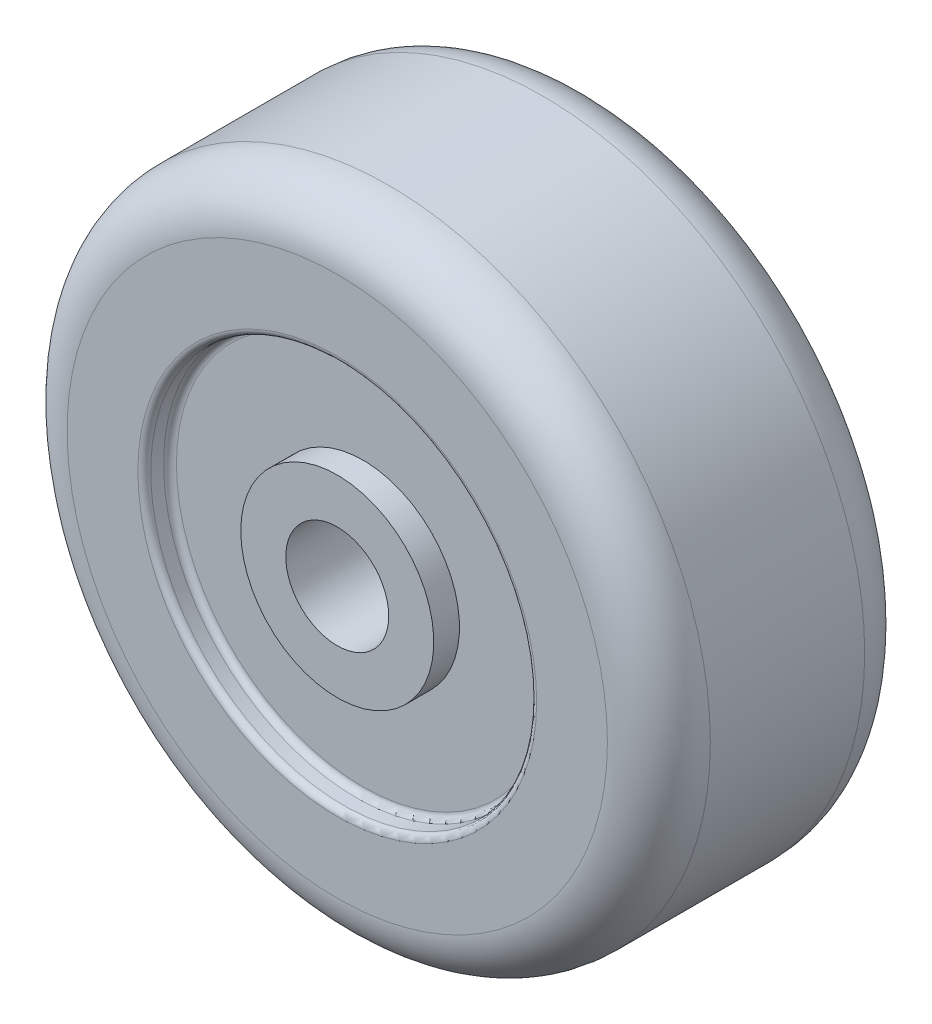
ISO-10303-21;
HEADER;
FILE_DESCRIPTION(('STEP AP214'),'2;1');
FILE_NAME('part.step','',(''),(''),'','','');
FILE_SCHEMA(('AUTOMOTIVE_DESIGN { 1 0 10303 214 1 1 1 1 }'));
ENDSEC;
DATA;
#1=APPLICATION_CONTEXT('core data for automotive mechanical design processes');
#2=APPLICATION_PROTOCOL_DEFINITION('international standard','automotive_design',2000,#1);
#3=PRODUCT_CONTEXT('',#1,'mechanical');
#4=PRODUCT('Part','Part','',(#3));
#5=PRODUCT_RELATED_PRODUCT_CATEGORY('part','',(#4));
#6=PRODUCT_DEFINITION_FORMATION('','',#4);
#7=PRODUCT_DEFINITION_CONTEXT('part definition',#1,'design');
#8=PRODUCT_DEFINITION('design','',#6,#7);
#9=PRODUCT_DEFINITION_SHAPE('','',#8);
#10=(LENGTH_UNIT() NAMED_UNIT(*) SI_UNIT(.MILLI.,.METRE.));
#11=(NAMED_UNIT(*) PLANE_ANGLE_UNIT() SI_UNIT($,.RADIAN.));
#12=(NAMED_UNIT(*) SI_UNIT($,.STERADIAN.) SOLID_ANGLE_UNIT());
#13=UNCERTAINTY_MEASURE_WITH_UNIT(LENGTH_MEASURE(1.E-05),#10,'distance_accuracy_value','');
#14=(GEOMETRIC_REPRESENTATION_CONTEXT(3) GLOBAL_UNCERTAINTY_ASSIGNED_CONTEXT((#13)) GLOBAL_UNIT_ASSIGNED_CONTEXT((#10,
#11,#12)) REPRESENTATION_CONTEXT('',''));
#15=CARTESIAN_POINT('',(0.,0.,0.));
#16=DIRECTION('',(0.,0.,1.));
#17=DIRECTION('',(1.,0.,0.));
#18=AXIS2_PLACEMENT_3D('',#15,#16,#17);
#19=CARTESIAN_POINT('',(0.,0.,10.));
#20=DIRECTION('',(0.,0.,1.));
#21=DIRECTION('',(1.,0.,0.));
#22=AXIS2_PLACEMENT_3D('',#19,#20,#21);
#23=PLANE('',#22);
#24=CARTESIAN_POINT('',(0.,0.,10.));
#25=DIRECTION('',(0.,0.,1.));
#26=DIRECTION('',(1.,0.,0.));
#27=AXIS2_PLACEMENT_3D('',#24,#25,#26);
#28=CIRCLE('',#27,4.);
#29=CARTESIAN_POINT('',(4.,0.,10.));
#30=VERTEX_POINT('',#29);
#31=EDGE_CURVE('E58',#30,#30,#28,.T.);
#32=ORIENTED_EDGE('',*,*,#31,.F.);
#33=EDGE_LOOP('',(#32));
#34=FACE_BOUND('',#33,.T.);
#35=CARTESIAN_POINT('',(0.,0.,10.));
#36=DIRECTION('',(0.,0.,-1.));
#37=DIRECTION('',(-1.,0.,0.));
#38=AXIS2_PLACEMENT_3D('',#35,#36,#37);
#39=CIRCLE('',#38,7.5);
#40=CARTESIAN_POINT('',(-7.5,0.,10.));
#41=VERTEX_POINT('',#40);
#42=EDGE_CURVE('E71',#41,#41,#39,.T.);
#43=ORIENTED_EDGE('',*,*,#42,.F.);
#44=EDGE_LOOP('',(#43));
#45=FACE_BOUND('',#44,.T.);
#46=ADVANCED_FACE('F14',(#34,#45),#23,.T.);
#47=CARTESIAN_POINT('',(0.,0.,-10.));
#48=DIRECTION('',(0.,0.,1.));
#49=DIRECTION('',(1.,0.,0.));
#50=AXIS2_PLACEMENT_3D('',#47,#48,#49);
#51=PLANE('',#50);
#52=CARTESIAN_POINT('',(0.,0.,-10.));
#53=DIRECTION('',(0.,0.,1.));
#54=DIRECTION('',(1.,0.,0.));
#55=AXIS2_PLACEMENT_3D('',#52,#53,#54);
#56=CIRCLE('',#55,4.);
#57=CARTESIAN_POINT('',(4.,0.,-10.));
#58=VERTEX_POINT('',#57);
#59=EDGE_CURVE('E59',#58,#58,#56,.T.);
#60=ORIENTED_EDGE('',*,*,#59,.T.);
#61=EDGE_LOOP('',(#60));
#62=FACE_BOUND('',#61,.T.);
#63=CARTESIAN_POINT('',(0.,0.,-10.));
#64=DIRECTION('',(0.,0.,-1.));
#65=DIRECTION('',(-1.,0.,0.));
#66=AXIS2_PLACEMENT_3D('',#63,#64,#65);
#67=CIRCLE('',#66,7.5);
#68=CARTESIAN_POINT('',(-7.5,0.,-10.));
#69=VERTEX_POINT('',#68);
#70=EDGE_CURVE('E65',#69,#69,#67,.T.);
#71=ORIENTED_EDGE('',*,*,#70,.T.);
#72=EDGE_LOOP('',(#71));
#73=FACE_BOUND('',#72,.T.);
#74=ADVANCED_FACE('F88',(#62,#73),#51,.F.);
#75=CARTESIAN_POINT('',(0.,0.,10.));
#76=DIRECTION('',(0.,0.,1.));
#77=DIRECTION('',(1.,0.,0.));
#78=AXIS2_PLACEMENT_3D('',#75,#76,#77);
#79=CIRCLE('',#78,15.5);
#80=CARTESIAN_POINT('',(15.5,0.,10.));
#81=VERTEX_POINT('',#80);
#82=EDGE_CURVE('E29',#81,#81,#79,.F.);
#83=ORIENTED_EDGE('',*,*,#82,.T.);
#84=EDGE_LOOP('',(#83));
#85=FACE_BOUND('',#84,.T.);
#86=CARTESIAN_POINT('',(0.,0.,10.));
#87=DIRECTION('',(0.,0.,1.));
#88=DIRECTION('',(1.,0.,0.));
#89=AXIS2_PLACEMENT_3D('',#86,#87,#88);
#90=CIRCLE('',#89,21.);
#91=CARTESIAN_POINT('',(21.,0.,10.));
#92=VERTEX_POINT('',#91);
#93=EDGE_CURVE('E55',#92,#92,#90,.T.);
#94=ORIENTED_EDGE('',*,*,#93,.T.);
#95=EDGE_LOOP('',(#94));
#96=FACE_BOUND('',#95,.T.);
#97=ADVANCED_FACE('F91',(#85,#96),#23,.T.);
#98=CARTESIAN_POINT('',(0.,0.,-10.));
#99=DIRECTION('',(0.,0.,1.));
#100=DIRECTION('',(1.,0.,0.));
#101=AXIS2_PLACEMENT_3D('',#98,#99,#100);
#102=CIRCLE('',#101,15.5);
#103=CARTESIAN_POINT('',(15.5,0.,-10.));
#104=VERTEX_POINT('',#103);
#105=EDGE_CURVE('E37',#104,#104,#102,.T.);
#106=ORIENTED_EDGE('',*,*,#105,.T.);
#107=EDGE_LOOP('',(#106));
#108=FACE_BOUND('',#107,.T.);
#109=CARTESIAN_POINT('',(0.,0.,-10.));
#110=DIRECTION('',(0.,0.,1.));
#111=DIRECTION('',(1.,0.,0.));
#112=AXIS2_PLACEMENT_3D('',#109,#110,#111);
#113=CIRCLE('',#112,21.);
#114=CARTESIAN_POINT('',(21.,0.,-10.));
#115=VERTEX_POINT('',#114);
#116=EDGE_CURVE('E46',#115,#115,#113,.F.);
#117=ORIENTED_EDGE('',*,*,#116,.T.);
#118=EDGE_LOOP('',(#117));
#119=FACE_BOUND('',#118,.T.);
#120=ADVANCED_FACE('F99',(#108,#119),#51,.F.);
#121=CARTESIAN_POINT('',(0.,0.,10.));
#122=DIRECTION('',(0.,0.,-1.));
#123=DIRECTION('',(-1.,0.,0.));
#124=AXIS2_PLACEMENT_3D('',#121,#122,#123);
#125=CYLINDRICAL_SURFACE('',#124,25.);
#126=CARTESIAN_POINT('',(0.,0.,6.));
#127=DIRECTION('',(0.,0.,1.));
#128=DIRECTION('',(1.,0.,0.));
#129=AXIS2_PLACEMENT_3D('',#126,#127,#128);
#130=CIRCLE('',#129,25.);
#131=CARTESIAN_POINT('',(25.,0.,6.));
#132=VERTEX_POINT('',#131);
#133=EDGE_CURVE('E49',#132,#132,#130,.F.);
#134=ORIENTED_EDGE('',*,*,#133,.T.);
#135=EDGE_LOOP('',(#134));
#136=FACE_BOUND('',#135,.T.);
#137=CARTESIAN_POINT('',(0.,0.,-6.));
#138=DIRECTION('',(0.,0.,1.));
#139=DIRECTION('',(1.,0.,0.));
#140=AXIS2_PLACEMENT_3D('',#137,#138,#139);
#141=CIRCLE('',#140,25.);
#142=CARTESIAN_POINT('',(25.,0.,-6.));
#143=VERTEX_POINT('',#142);
#144=EDGE_CURVE('E52',#143,#143,#141,.T.);
#145=ORIENTED_EDGE('',*,*,#144,.T.);
#146=EDGE_LOOP('',(#145));
#147=FACE_BOUND('',#146,.T.);
#148=ADVANCED_FACE('F108',(#136,#147),#125,.T.);
#149=CARTESIAN_POINT('',(0.,0.,10.));
#150=DIRECTION('',(0.,0.,-1.));
#151=DIRECTION('',(-1.,0.,0.));
#152=AXIS2_PLACEMENT_3D('',#149,#150,#151);
#153=CYLINDRICAL_SURFACE('',#152,4.);
#154=ORIENTED_EDGE('',*,*,#31,.T.);
#155=EDGE_LOOP('',(#154));
#156=FACE_BOUND('',#155,.T.);
#157=ORIENTED_EDGE('',*,*,#59,.F.);
#158=EDGE_LOOP('',(#157));
#159=FACE_BOUND('',#158,.T.);
#160=ADVANCED_FACE('F117',(#156,#159),#153,.F.);
#161=CARTESIAN_POINT('',(0.,0.,6.));
#162=DIRECTION('',(0.,0.,1.));
#163=DIRECTION('',(1.,0.,0.));
#164=AXIS2_PLACEMENT_3D('',#161,#162,#163);
#165=TOROIDAL_SURFACE('',#164,21.,4.);
#166=ORIENTED_EDGE('',*,*,#133,.F.);
#167=EDGE_LOOP('',(#166));
#168=FACE_BOUND('',#167,.T.);
#169=ORIENTED_EDGE('',*,*,#93,.F.);
#170=EDGE_LOOP('',(#169));
#171=FACE_BOUND('',#170,.T.);
#172=ADVANCED_FACE('F114',(#168,#171),#165,.T.);
#173=CARTESIAN_POINT('',(0.,0.,-6.));
#174=DIRECTION('',(0.,0.,1.));
#175=DIRECTION('',(1.,0.,0.));
#176=AXIS2_PLACEMENT_3D('',#173,#174,#175);
#177=TOROIDAL_SURFACE('',#176,21.,4.);
#178=ORIENTED_EDGE('',*,*,#116,.F.);
#179=EDGE_LOOP('',(#178));
#180=FACE_BOUND('',#179,.T.);
#181=ORIENTED_EDGE('',*,*,#144,.F.);
#182=EDGE_LOOP('',(#181));
#183=FACE_BOUND('',#182,.T.);
#184=ADVANCED_FACE('F116',(#180,#183),#177,.T.);
#185=CARTESIAN_POINT('',(0.,0.,-8.));
#186=DIRECTION('',(0.,0.,-1.));
#187=DIRECTION('',(-1.,0.,0.));
#188=AXIS2_PLACEMENT_3D('',#185,#186,#187);
#189=CYLINDRICAL_SURFACE('',#188,15.);
#190=CARTESIAN_POINT('',(0.,0.,-9.5));
#191=DIRECTION('',(0.,0.,1.));
#192=DIRECTION('',(1.,0.,0.));
#193=AXIS2_PLACEMENT_3D('',#190,#191,#192);
#194=CIRCLE('',#193,15.);
#195=CARTESIAN_POINT('',(15.,0.,-9.5));
#196=VERTEX_POINT('',#195);
#197=EDGE_CURVE('E40',#196,#196,#194,.F.);
#198=ORIENTED_EDGE('',*,*,#197,.T.);
#199=EDGE_LOOP('',(#198));
#200=FACE_BOUND('',#199,.T.);
#201=CARTESIAN_POINT('',(0.,0.,-8.5));
#202=DIRECTION('',(0.,0.,-1.));
#203=DIRECTION('',(-1.,0.,0.));
#204=AXIS2_PLACEMENT_3D('',#201,#202,#203);
#205=CIRCLE('',#204,15.);
#206=CARTESIAN_POINT('',(-15.,0.,-8.5));
#207=VERTEX_POINT('',#206);
#208=EDGE_CURVE('E43',#207,#207,#205,.F.);
#209=ORIENTED_EDGE('',*,*,#208,.T.);
#210=EDGE_LOOP('',(#209));
#211=FACE_BOUND('',#210,.T.);
#212=ADVANCED_FACE('F125',(#200,#211),#189,.F.);
#213=CARTESIAN_POINT('',(0.,0.,-8.));
#214=DIRECTION('',(0.,0.,-1.));
#215=DIRECTION('',(-1.,0.,0.));
#216=AXIS2_PLACEMENT_3D('',#213,#214,#215);
#217=PLANE('',#216);
#218=CARTESIAN_POINT('',(0.,0.,-8.));
#219=DIRECTION('',(0.,0.,-1.));
#220=DIRECTION('',(-1.,0.,0.));
#221=AXIS2_PLACEMENT_3D('',#218,#219,#220);
#222=CIRCLE('',#221,14.5);
#223=CARTESIAN_POINT('',(-14.5,0.,-8.));
#224=VERTEX_POINT('',#223);
#225=EDGE_CURVE('E34',#224,#224,#222,.T.);
#226=ORIENTED_EDGE('',*,*,#225,.T.);
#227=EDGE_LOOP('',(#226));
#228=FACE_BOUND('',#227,.T.);
#229=CARTESIAN_POINT('',(0.,0.,-8.));
#230=DIRECTION('',(0.,0.,-1.));
#231=DIRECTION('',(-1.,0.,0.));
#232=AXIS2_PLACEMENT_3D('',#229,#230,#231);
#233=CIRCLE('',#232,7.5);
#234=CARTESIAN_POINT('',(-7.5,0.,-8.));
#235=VERTEX_POINT('',#234);
#236=EDGE_CURVE('E62',#235,#235,#233,.T.);
#237=ORIENTED_EDGE('',*,*,#236,.F.);
#238=EDGE_LOOP('',(#237));
#239=FACE_BOUND('',#238,.T.);
#240=ADVANCED_FACE('F164',(#228,#239),#217,.T.);
#241=CARTESIAN_POINT('',(0.,0.,-8.));
#242=DIRECTION('',(0.,0.,-1.));
#243=DIRECTION('',(-1.,0.,0.));
#244=AXIS2_PLACEMENT_3D('',#241,#242,#243);
#245=CYLINDRICAL_SURFACE('',#244,7.5);
#246=ORIENTED_EDGE('',*,*,#236,.T.);
#247=EDGE_LOOP('',(#246));
#248=FACE_BOUND('',#247,.T.);
#249=ORIENTED_EDGE('',*,*,#70,.F.);
#250=EDGE_LOOP('',(#249));
#251=FACE_BOUND('',#250,.T.);
#252=ADVANCED_FACE('F159',(#248,#251),#245,.T.);
#253=CARTESIAN_POINT('',(0.,0.,8.));
#254=DIRECTION('',(0.,0.,1.));
#255=DIRECTION('',(-1.,0.,0.));
#256=AXIS2_PLACEMENT_3D('',#253,#254,#255);
#257=PLANE('',#256);
#258=CARTESIAN_POINT('',(0.,0.,8.));
#259=DIRECTION('',(0.,0.,1.));
#260=DIRECTION('',(1.,0.,0.));
#261=AXIS2_PLACEMENT_3D('',#258,#259,#260);
#262=CIRCLE('',#261,14.5);
#263=CARTESIAN_POINT('',(14.5,0.,8.));
#264=VERTEX_POINT('',#263);
#265=EDGE_CURVE('E10',#264,#264,#262,.T.);
#266=ORIENTED_EDGE('',*,*,#265,.T.);
#267=EDGE_LOOP('',(#266));
#268=FACE_BOUND('',#267,.T.);
#269=CARTESIAN_POINT('',(0.,0.,8.));
#270=DIRECTION('',(0.,0.,-1.));
#271=DIRECTION('',(-1.,0.,0.));
#272=AXIS2_PLACEMENT_3D('',#269,#270,#271);
#273=CIRCLE('',#272,7.5);
#274=CARTESIAN_POINT('',(-7.5,0.,8.));
#275=VERTEX_POINT('',#274);
#276=EDGE_CURVE('E68',#275,#275,#273,.T.);
#277=ORIENTED_EDGE('',*,*,#276,.T.);
#278=EDGE_LOOP('',(#277));
#279=FACE_BOUND('',#278,.T.);
#280=ADVANCED_FACE('F77',(#268,#279),#257,.T.);
#281=CARTESIAN_POINT('',(0.,0.,8.));
#282=DIRECTION('',(0.,0.,1.));
#283=DIRECTION('',(1.,0.,0.));
#284=AXIS2_PLACEMENT_3D('',#281,#282,#283);
#285=CYLINDRICAL_SURFACE('',#284,15.);
#286=CARTESIAN_POINT('',(0.,0.,9.5));
#287=DIRECTION('',(0.,0.,1.));
#288=DIRECTION('',(1.,0.,0.));
#289=AXIS2_PLACEMENT_3D('',#286,#287,#288);
#290=CIRCLE('',#289,15.);
#291=CARTESIAN_POINT('',(15.,0.,9.5));
#292=VERTEX_POINT('',#291);
#293=EDGE_CURVE('E21',#292,#292,#290,.T.);
#294=ORIENTED_EDGE('',*,*,#293,.T.);
#295=EDGE_LOOP('',(#294));
#296=FACE_BOUND('',#295,.T.);
#297=CARTESIAN_POINT('',(0.,0.,8.5));
#298=DIRECTION('',(0.,0.,1.));
#299=DIRECTION('',(1.,0.,0.));
#300=AXIS2_PLACEMENT_3D('',#297,#298,#299);
#301=CIRCLE('',#300,15.);
#302=CARTESIAN_POINT('',(15.,0.,8.5));
#303=VERTEX_POINT('',#302);
#304=EDGE_CURVE('E25',#303,#303,#301,.F.);
#305=ORIENTED_EDGE('',*,*,#304,.T.);
#306=EDGE_LOOP('',(#305));
#307=FACE_BOUND('',#306,.T.);
#308=ADVANCED_FACE('F83',(#296,#307),#285,.F.);
#309=CARTESIAN_POINT('',(0.,0.,8.));
#310=DIRECTION('',(0.,0.,1.));
#311=DIRECTION('',(1.,0.,0.));
#312=AXIS2_PLACEMENT_3D('',#309,#310,#311);
#313=CYLINDRICAL_SURFACE('',#312,7.5);
#314=ORIENTED_EDGE('',*,*,#276,.F.);
#315=EDGE_LOOP('',(#314));
#316=FACE_BOUND('',#315,.T.);
#317=ORIENTED_EDGE('',*,*,#42,.T.);
#318=EDGE_LOOP('',(#317));
#319=FACE_BOUND('',#318,.T.);
#320=ADVANCED_FACE('F79',(#316,#319),#313,.T.);
#321=CARTESIAN_POINT('',(0.,0.,-9.5));
#322=DIRECTION('',(0.,0.,1.));
#323=DIRECTION('',(1.,0.,0.));
#324=AXIS2_PLACEMENT_3D('',#321,#322,#323);
#325=TOROIDAL_SURFACE('',#324,15.5,0.5);
#326=ORIENTED_EDGE('',*,*,#105,.F.);
#327=EDGE_LOOP('',(#326));
#328=FACE_BOUND('',#327,.T.);
#329=ORIENTED_EDGE('',*,*,#197,.F.);
#330=EDGE_LOOP('',(#329));
#331=FACE_BOUND('',#330,.T.);
#332=ADVANCED_FACE('F82',(#328,#331),#325,.T.);
#333=CARTESIAN_POINT('',(0.,0.,-8.5));
#334=DIRECTION('',(0.,0.,-1.));
#335=DIRECTION('',(-1.,0.,0.));
#336=AXIS2_PLACEMENT_3D('',#333,#334,#335);
#337=TOROIDAL_SURFACE('',#336,14.5,0.5);
#338=ORIENTED_EDGE('',*,*,#208,.F.);
#339=EDGE_LOOP('',(#338));
#340=FACE_BOUND('',#339,.T.);
#341=ORIENTED_EDGE('',*,*,#225,.F.);
#342=EDGE_LOOP('',(#341));
#343=FACE_BOUND('',#342,.T.);
#344=ADVANCED_FACE('F134',(#340,#343),#337,.F.);
#345=CARTESIAN_POINT('',(0.,0.,9.5));
#346=DIRECTION('',(0.,0.,1.));
#347=DIRECTION('',(1.,0.,0.));
#348=AXIS2_PLACEMENT_3D('',#345,#346,#347);
#349=TOROIDAL_SURFACE('',#348,15.5,0.5);
#350=ORIENTED_EDGE('',*,*,#293,.F.);
#351=EDGE_LOOP('',(#350));
#352=FACE_BOUND('',#351,.T.);
#353=ORIENTED_EDGE('',*,*,#82,.F.);
#354=EDGE_LOOP('',(#353));
#355=FACE_BOUND('',#354,.T.);
#356=ADVANCED_FACE('F137',(#352,#355),#349,.T.);
#357=CARTESIAN_POINT('',(0.,0.,8.5));
#358=DIRECTION('',(0.,0.,1.));
#359=DIRECTION('',(1.,0.,0.));
#360=AXIS2_PLACEMENT_3D('',#357,#358,#359);
#361=TOROIDAL_SURFACE('',#360,14.5,0.5);
#362=ORIENTED_EDGE('',*,*,#265,.F.);
#363=EDGE_LOOP('',(#362));
#364=FACE_BOUND('',#363,.T.);
#365=ORIENTED_EDGE('',*,*,#304,.F.);
#366=EDGE_LOOP('',(#365));
#367=FACE_BOUND('',#366,.T.);
#368=ADVANCED_FACE('F16',(#364,#367),#361,.F.);
#369=CLOSED_SHELL('',(#46,#74,#97,#120,#148,#160,#172,#184,#212,#240,#252,#280,#308,#320,#332,
#344,#356,#368));
#370=MANIFOLD_SOLID_BREP('B1',#369);
#371=ADVANCED_BREP_SHAPE_REPRESENTATION('',(#18,#370),#14);
#372=SHAPE_DEFINITION_REPRESENTATION(#9,#371);
ENDSEC;
END-ISO-10303-21;
